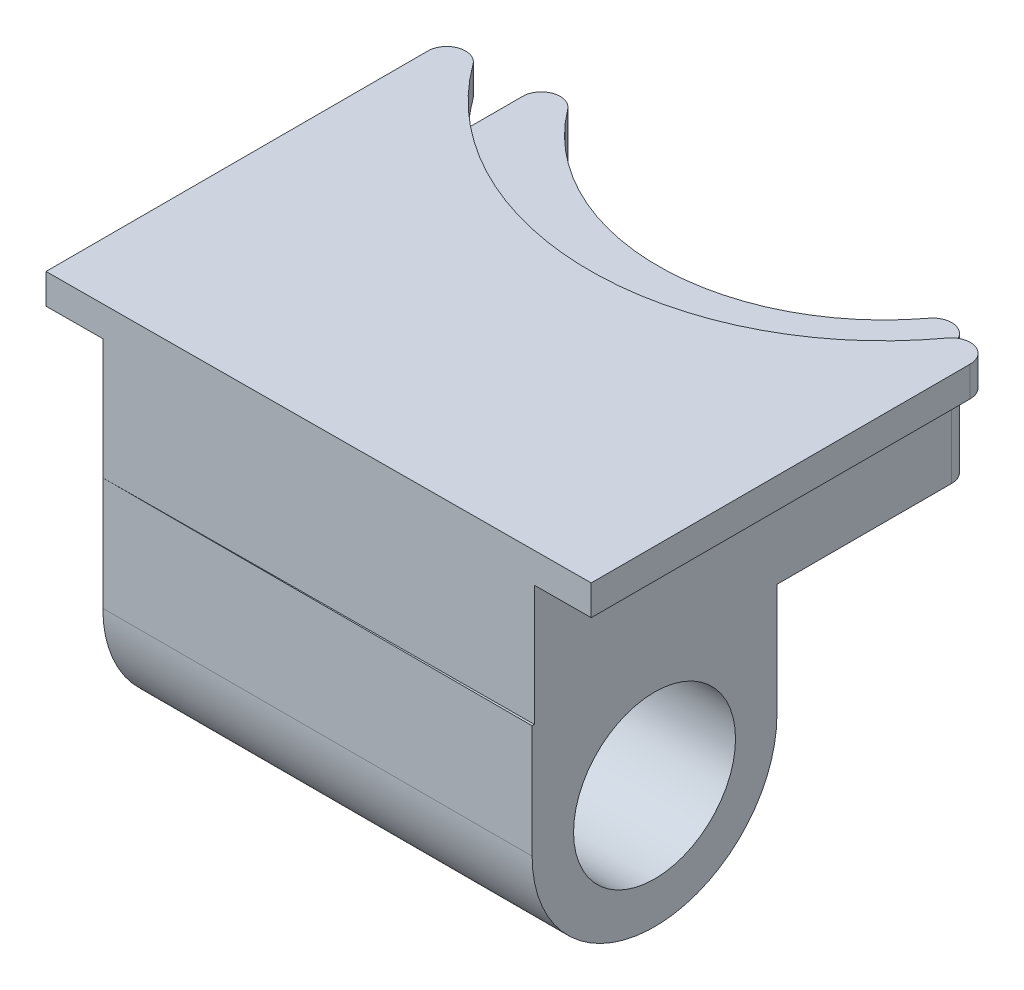
ISO-10303-21;
HEADER;
FILE_DESCRIPTION(('STEP AP214'),'2;1');
FILE_NAME('part.step','',(''),(''),'','','');
FILE_SCHEMA(('AUTOMOTIVE_DESIGN { 1 0 10303 214 1 1 1 1 }'));
ENDSEC;
DATA;
#1=APPLICATION_CONTEXT('core data for automotive mechanical design processes');
#2=APPLICATION_PROTOCOL_DEFINITION('international standard','automotive_design',2000,#1);
#3=PRODUCT_CONTEXT('',#1,'mechanical');
#4=PRODUCT('Part','Part','',(#3));
#5=PRODUCT_RELATED_PRODUCT_CATEGORY('part','',(#4));
#6=PRODUCT_DEFINITION_FORMATION('','',#4);
#7=PRODUCT_DEFINITION_CONTEXT('part definition',#1,'design');
#8=PRODUCT_DEFINITION('design','',#6,#7);
#9=PRODUCT_DEFINITION_SHAPE('','',#8);
#10=(LENGTH_UNIT() NAMED_UNIT(*) SI_UNIT(.MILLI.,.METRE.));
#11=(NAMED_UNIT(*) PLANE_ANGLE_UNIT() SI_UNIT($,.RADIAN.));
#12=(NAMED_UNIT(*) SI_UNIT($,.STERADIAN.) SOLID_ANGLE_UNIT());
#13=UNCERTAINTY_MEASURE_WITH_UNIT(LENGTH_MEASURE(1.E-05),#10,'distance_accuracy_value','');
#14=(GEOMETRIC_REPRESENTATION_CONTEXT(3) GLOBAL_UNCERTAINTY_ASSIGNED_CONTEXT((#13)) GLOBAL_UNIT_ASSIGNED_CONTEXT((#10,
#11,#12)) REPRESENTATION_CONTEXT('',''));
#15=CARTESIAN_POINT('',(0.,0.,0.));
#16=DIRECTION('',(0.,0.,1.));
#17=DIRECTION('',(1.,0.,0.));
#18=AXIS2_PLACEMENT_3D('',#15,#16,#17);
#19=CARTESIAN_POINT('',(0.000957071459153913,4.,-0.0129703369035582));
#20=DIRECTION('',(0.,-1.,0.));
#21=DIRECTION('',(0.,0.,-1.));
#22=AXIS2_PLACEMENT_3D('',#19,#20,#21);
#23=CYLINDRICAL_SURFACE('',#22,6.);
#24=CARTESIAN_POINT('',(0.000957071459153913,3.2,-0.0129703369035582));
#25=DIRECTION('',(0.,1.,0.));
#26=DIRECTION('',(0.,0.,1.));
#27=AXIS2_PLACEMENT_3D('',#24,#25,#26);
#28=CIRCLE('',#27,6.);
#29=CARTESIAN_POINT('',(-4.79902998778424,3.2,3.58704691737398));
#30=VERTEX_POINT('',#29);
#31=CARTESIAN_POINT('',(4.79917722954718,3.2,3.58940156429122));
#32=VERTEX_POINT('',#31);
#33=EDGE_CURVE('E204',#30,#32,#28,.T.);
#34=ORIENTED_EDGE('',*,*,#33,.T.);
#35=DIRECTION('',(0.,-1.,0.));
#36=VECTOR('',#35,1.);
#37=CARTESIAN_POINT('',(4.79917722954718,4.,3.58940156429122));
#38=LINE('',#37,#36);
#39=CARTESIAN_POINT('',(4.79917722954718,0.,3.58940156429122));
#40=VERTEX_POINT('',#39);
#41=EDGE_CURVE('E259',#32,#40,#38,.T.);
#42=ORIENTED_EDGE('',*,*,#41,.T.);
#43=CARTESIAN_POINT('',(0.000957071459153913,0.,-0.0129703369035582));
#44=DIRECTION('',(0.,1.,0.));
#45=DIRECTION('',(0.,0.,1.));
#46=AXIS2_PLACEMENT_3D('',#43,#44,#45);
#47=CIRCLE('',#46,6.);
#48=CARTESIAN_POINT('',(-4.79902998778424,0.,3.58704691737398));
#49=VERTEX_POINT('',#48);
#50=EDGE_CURVE('E242',#49,#40,#47,.T.);
#51=ORIENTED_EDGE('',*,*,#50,.F.);
#52=DIRECTION('',(0.,-1.,0.));
#53=VECTOR('',#52,1.);
#54=CARTESIAN_POINT('',(-4.79902998778424,4.,3.58704691737398));
#55=LINE('',#54,#53);
#56=EDGE_CURVE('E256',#49,#30,#55,.F.);
#57=ORIENTED_EDGE('',*,*,#56,.T.);
#58=EDGE_LOOP('',(#34,#42,#51,#57));
#59=FACE_BOUND('',#58,.T.);
#60=ADVANCED_FACE('F42',(#59),#23,.F.);
#61=CARTESIAN_POINT('',(-5.69902890938785,0.,0.299999999999997));
#62=DIRECTION('',(-1.,0.,0.));
#63=DIRECTION('',(0.,0.,1.));
#64=AXIS2_PLACEMENT_3D('',#61,#62,#63);
#65=PLANE('',#64);
#66=DIRECTION('',(0.,0.,-1.));
#67=VECTOR('',#66,1.);
#68=CARTESIAN_POINT('',(-5.69902890938785,3.2,0.299999999999997));
#69=LINE('',#68,#67);
#70=CARTESIAN_POINT('',(-5.69902890938785,3.2,5.32551119517756));
#71=VERTEX_POINT('',#70);
#72=CARTESIAN_POINT('',(-5.69902890938785,3.2,3.88704835523044));
#73=VERTEX_POINT('',#72);
#74=EDGE_CURVE('E207',#71,#73,#69,.T.);
#75=ORIENTED_EDGE('',*,*,#74,.T.);
#76=DIRECTION('',(0.,-1.,0.));
#77=VECTOR('',#76,1.);
#78=CARTESIAN_POINT('',(-5.69902890938785,0.,3.88704835523044));
#79=LINE('',#78,#77);
#80=CARTESIAN_POINT('',(-5.69902890938785,0.,3.88704835523044));
#81=VERTEX_POINT('',#80);
#82=EDGE_CURVE('E12',#73,#81,#79,.T.);
#83=ORIENTED_EDGE('',*,*,#82,.T.);
#84=DIRECTION('',(0.,0.,1.));
#85=VECTOR('',#84,1.);
#86=CARTESIAN_POINT('',(-5.69902890938785,0.,0.299999999999997));
#87=LINE('',#86,#85);
#88=CARTESIAN_POINT('',(-5.69902890938785,0.,8.53014904998992));
#89=VERTEX_POINT('',#88);
#90=EDGE_CURVE('E248',#81,#89,#87,.T.);
#91=ORIENTED_EDGE('',*,*,#90,.T.);
#92=DIRECTION('',(0.,-1.,0.));
#93=VECTOR('',#92,1.);
#94=CARTESIAN_POINT('',(-5.69902890938785,-3.,8.53014904998992));
#95=LINE('',#94,#93);
#96=CARTESIAN_POINT('',(-5.69902890938785,-3.,8.53014904998992));
#97=VERTEX_POINT('',#96);
#98=EDGE_CURVE('E57',#89,#97,#95,.T.);
#99=ORIENTED_EDGE('',*,*,#98,.T.);
#100=CARTESIAN_POINT('',(-5.69902890938785,-3.,11.7801490499899));
#101=DIRECTION('',(-1.,0.,0.));
#102=DIRECTION('',(0.,0.,-1.));
#103=AXIS2_PLACEMENT_3D('',#100,#101,#102);
#104=CIRCLE('',#103,3.25);
#105=CARTESIAN_POINT('',(-5.69902890938785,-3.,15.0301490499899));
#106=VERTEX_POINT('',#105);
#107=EDGE_CURVE('E345',#97,#106,#104,.T.);
#108=ORIENTED_EDGE('',*,*,#107,.T.);
#109=DIRECTION('',(0.,1.,0.));
#110=VECTOR('',#109,1.);
#111=CARTESIAN_POINT('',(-5.69902890938785,0.,15.0301490499899));
#112=LINE('',#111,#110);
#113=CARTESIAN_POINT('',(-5.69902890938785,0.,15.0301490499899));
#114=VERTEX_POINT('',#113);
#115=EDGE_CURVE('E313',#106,#114,#112,.T.);
#116=ORIENTED_EDGE('',*,*,#115,.T.);
#117=DIRECTION('',(0.,1.,0.));
#118=VECTOR('',#117,1.);
#119=CARTESIAN_POINT('',(-5.69902890938785,4.,15.0301490499899));
#120=LINE('',#119,#118);
#121=CARTESIAN_POINT('',(-5.69902890938785,3.2,15.0301490499899));
#122=VERTEX_POINT('',#121);
#123=EDGE_CURVE('E241',#114,#122,#120,.T.);
#124=ORIENTED_EDGE('',*,*,#123,.T.);
#125=DIRECTION('',(0.,0.,-1.));
#126=VECTOR('',#125,1.);
#127=CARTESIAN_POINT('',(-5.69902890938785,3.2,0.299999999999997));
#128=LINE('',#127,#126);
#129=EDGE_CURVE('E234',#122,#71,#128,.T.);
#130=ORIENTED_EDGE('',*,*,#129,.T.);
#131=EDGE_LOOP('',(#75,#83,#91,#99,#108,#116,#124,#130));
#132=FACE_BOUND('',#131,.T.);
#133=CARTESIAN_POINT('',(-5.69902890938785,-3.,11.7801490499899));
#134=DIRECTION('',(-1.,0.,0.));
#135=DIRECTION('',(0.,0.,1.));
#136=AXIS2_PLACEMENT_3D('',#133,#134,#135);
#137=CIRCLE('',#136,2.14999999999998);
#138=CARTESIAN_POINT('',(-5.69902890938785,-3.,13.9301490499899));
#139=VERTEX_POINT('',#138);
#140=EDGE_CURVE('E180',#139,#139,#137,.T.);
#141=ORIENTED_EDGE('',*,*,#140,.F.);
#142=EDGE_LOOP('',(#141));
#143=FACE_BOUND('',#142,.T.);
#144=ADVANCED_FACE('F309',(#132,#143),#65,.T.);
#145=CARTESIAN_POINT('',(5.69902890938785,0.,19.5695557882271));
#146=DIRECTION('',(1.,0.,0.));
#147=DIRECTION('',(0.,0.,-1.));
#148=AXIS2_PLACEMENT_3D('',#145,#146,#147);
#149=PLANE('',#148);
#150=DIRECTION('',(0.,-1.,0.));
#151=VECTOR('',#150,1.);
#152=CARTESIAN_POINT('',(5.69902890938785,4.,14.9703067405696));
#153=LINE('',#152,#151);
#154=CARTESIAN_POINT('',(5.69902890938785,3.2,14.9703067405696));
#155=VERTEX_POINT('',#154);
#156=CARTESIAN_POINT('',(5.69902890938785,0.,14.9703067405696));
#157=VERTEX_POINT('',#156);
#158=EDGE_CURVE('E167',#155,#157,#153,.T.);
#159=ORIENTED_EDGE('',*,*,#158,.T.);
#160=DIRECTION('',(0.,0.,-1.));
#161=VECTOR('',#160,1.);
#162=CARTESIAN_POINT('',(5.69902890938785,0.,15.0301490499899));
#163=LINE('',#162,#161);
#164=CARTESIAN_POINT('',(5.69902890938785,0.,15.0301490499899));
#165=VERTEX_POINT('',#164);
#166=EDGE_CURVE('E158',#165,#157,#163,.T.);
#167=ORIENTED_EDGE('',*,*,#166,.F.);
#168=DIRECTION('',(0.,1.,0.));
#169=VECTOR('',#168,1.);
#170=CARTESIAN_POINT('',(5.69902890938785,0.,15.0301490499899));
#171=LINE('',#170,#169);
#172=CARTESIAN_POINT('',(5.69902890938785,-3.,15.0301490499899));
#173=VERTEX_POINT('',#172);
#174=EDGE_CURVE('E163',#173,#165,#171,.T.);
#175=ORIENTED_EDGE('',*,*,#174,.F.);
#176=CARTESIAN_POINT('',(5.69902890938785,-3.,11.7801490499899));
#177=DIRECTION('',(1.,0.,0.));
#178=DIRECTION('',(0.,0.,-1.));
#179=AXIS2_PLACEMENT_3D('',#176,#177,#178);
#180=CIRCLE('',#179,3.25);
#181=CARTESIAN_POINT('',(5.69902890938785,-3.,8.53014904998992));
#182=VERTEX_POINT('',#181);
#183=EDGE_CURVE('E191',#182,#173,#180,.F.);
#184=ORIENTED_EDGE('',*,*,#183,.F.);
#185=DIRECTION('',(0.,-1.,0.));
#186=VECTOR('',#185,1.);
#187=CARTESIAN_POINT('',(5.69902890938785,-3.,8.53014904998992));
#188=LINE('',#187,#186);
#189=CARTESIAN_POINT('',(5.69902890938785,0.,8.53014904998992));
#190=VERTEX_POINT('',#189);
#191=EDGE_CURVE('E193',#190,#182,#188,.T.);
#192=ORIENTED_EDGE('',*,*,#191,.F.);
#193=DIRECTION('',(0.,0.,-1.));
#194=VECTOR('',#193,1.);
#195=CARTESIAN_POINT('',(5.69902890938785,0.,19.5695557882271));
#196=LINE('',#195,#194);
#197=CARTESIAN_POINT('',(5.69902890938785,0.,3.88959922272413));
#198=VERTEX_POINT('',#197);
#199=EDGE_CURVE('E247',#190,#198,#196,.T.);
#200=ORIENTED_EDGE('',*,*,#199,.T.);
#201=DIRECTION('',(0.,-1.,0.));
#202=VECTOR('',#201,1.);
#203=CARTESIAN_POINT('',(5.69902890938785,0.,3.88959922272412));
#204=LINE('',#203,#202);
#205=CARTESIAN_POINT('',(5.69902890938785,3.2,3.88959922272412));
#206=VERTEX_POINT('',#205);
#207=EDGE_CURVE('E267',#198,#206,#204,.F.);
#208=ORIENTED_EDGE('',*,*,#207,.T.);
#209=DIRECTION('',(0.,0.,1.));
#210=VECTOR('',#209,1.);
#211=CARTESIAN_POINT('',(5.69902890938785,3.2,19.5695557882271));
#212=LINE('',#211,#210);
#213=CARTESIAN_POINT('',(5.69902890938785,3.2,5.32551119517756));
#214=VERTEX_POINT('',#213);
#215=EDGE_CURVE('E201',#206,#214,#212,.T.);
#216=ORIENTED_EDGE('',*,*,#215,.T.);
#217=DIRECTION('',(0.,0.,1.));
#218=VECTOR('',#217,1.);
#219=CARTESIAN_POINT('',(5.69902890938785,3.2,19.5695557882271));
#220=LINE('',#219,#218);
#221=EDGE_CURVE('E252',#214,#155,#220,.T.);
#222=ORIENTED_EDGE('',*,*,#221,.T.);
#223=EDGE_LOOP('',(#159,#167,#175,#184,#192,#200,#208,#216,#222));
#224=FACE_BOUND('',#223,.T.);
#225=CARTESIAN_POINT('',(5.69902890938785,-3.,11.7801490499899));
#226=DIRECTION('',(1.,0.,0.));
#227=DIRECTION('',(0.,0.,-1.));
#228=AXIS2_PLACEMENT_3D('',#225,#226,#227);
#229=CIRCLE('',#228,2.14999999999998);
#230=CARTESIAN_POINT('',(5.69902890938785,-3.,9.63014904998995));
#231=VERTEX_POINT('',#230);
#232=EDGE_CURVE('E189',#231,#231,#229,.F.);
#233=ORIENTED_EDGE('',*,*,#232,.T.);
#234=EDGE_LOOP('',(#233));
#235=FACE_BOUND('',#234,.T.);
#236=ADVANCED_FACE('F160',(#224,#235),#149,.T.);
#237=CARTESIAN_POINT('',(0.0390904513321626,4.,-0.0265240419706443));
#238=DIRECTION('',(0.,1.,0.));
#239=DIRECTION('',(0.,0.,1.));
#240=AXIS2_PLACEMENT_3D('',#237,#238,#239);
#241=PLANE('',#240);
#242=DIRECTION('',(0.,0.,-1.));
#243=VECTOR('',#242,1.);
#244=CARTESIAN_POINT('',(7.2,4.,14.6624221776615));
#245=LINE('',#244,#243);
#246=CARTESIAN_POINT('',(7.2,4.,14.9624263123542));
#247=VERTEX_POINT('',#246);
#248=CARTESIAN_POINT('',(7.2,4.,4.89897948556635));
#249=VERTEX_POINT('',#248);
#250=EDGE_CURVE('E228',#247,#249,#245,.T.);
#251=ORIENTED_EDGE('',*,*,#250,.T.);
#252=CARTESIAN_POINT('',(6.7,4.,4.89897948556635));
#253=DIRECTION('',(0.,1.,0.));
#254=DIRECTION('',(0.,0.,1.));
#255=AXIS2_PLACEMENT_3D('',#252,#253,#254);
#256=CIRCLE('',#255,0.5);
#257=CARTESIAN_POINT('',(6.29638554216868,4.,4.6038602394479));
#258=VERTEX_POINT('',#257);
#259=EDGE_CURVE('E278',#249,#258,#256,.T.);
#260=ORIENTED_EDGE('',*,*,#259,.T.);
#261=CARTESIAN_POINT('',(0.,4.,0.));
#262=DIRECTION('',(0.,-1.,0.));
#263=DIRECTION('',(0.,0.,1.));
#264=AXIS2_PLACEMENT_3D('',#261,#262,#263);
#265=CIRCLE('',#264,7.8);
#266=CARTESIAN_POINT('',(-6.29638554216868,4.,4.6038602394479));
#267=VERTEX_POINT('',#266);
#268=EDGE_CURVE('E210',#258,#267,#265,.T.);
#269=ORIENTED_EDGE('',*,*,#268,.T.);
#270=CARTESIAN_POINT('',(-6.7,4.,4.89897948556636));
#271=DIRECTION('',(0.,1.,0.));
#272=DIRECTION('',(0.,0.,1.));
#273=AXIS2_PLACEMENT_3D('',#270,#271,#272);
#274=CIRCLE('',#273,0.5);
#275=CARTESIAN_POINT('',(-7.2,4.,4.89897948556636));
#276=VERTEX_POINT('',#275);
#277=EDGE_CURVE('E276',#267,#276,#274,.T.);
#278=ORIENTED_EDGE('',*,*,#277,.T.);
#279=DIRECTION('',(0.,0.,1.));
#280=VECTOR('',#279,1.);
#281=CARTESIAN_POINT('',(-7.2,4.,14.7380253435125));
#282=LINE('',#281,#280);
#283=CARTESIAN_POINT('',(-7.2,4.,15.0380294782053));
#284=VERTEX_POINT('',#283);
#285=EDGE_CURVE('E226',#276,#284,#282,.T.);
#286=ORIENTED_EDGE('',*,*,#285,.T.);
#287=DIRECTION('',(0.999986217880685,0.,-0.00525014749161145));
#288=VECTOR('',#287,1.);
#289=CARTESIAN_POINT('',(0.0390904513321626,4.,15.0000226618162));
#290=LINE('',#289,#288);
#291=EDGE_CURVE('E239',#284,#247,#290,.T.);
#292=ORIENTED_EDGE('',*,*,#291,.T.);
#293=EDGE_LOOP('',(#251,#260,#269,#278,#286,#292));
#294=FACE_BOUND('',#293,.T.);
#295=ADVANCED_FACE('F301',(#294),#241,.T.);
#296=CARTESIAN_POINT('',(0.0390904513321626,0.,-0.0265240419706443));
#297=DIRECTION('',(0.,1.,0.));
#298=DIRECTION('',(0.,0.,1.));
#299=AXIS2_PLACEMENT_3D('',#296,#297,#298);
#300=PLANE('',#299);
#301=ORIENTED_EDGE('',*,*,#199,.F.);
#302=DIRECTION('',(-1.,0.,0.));
#303=VECTOR('',#302,1.);
#304=CARTESIAN_POINT('',(14.7163733078236,0.,8.53014904998992));
#305=LINE('',#304,#303);
#306=EDGE_CURVE('E170',#190,#89,#305,.T.);
#307=ORIENTED_EDGE('',*,*,#306,.T.);
#308=ORIENTED_EDGE('',*,*,#90,.F.);
#309=CARTESIAN_POINT('',(-5.19902890938785,0.,3.88704835523044));
#310=DIRECTION('',(0.,1.,0.));
#311=DIRECTION('',(0.,0.,1.));
#312=AXIS2_PLACEMENT_3D('',#309,#310,#311);
#313=CIRCLE('',#312,0.5);
#314=EDGE_CURVE('E262',#81,#49,#313,.F.);
#315=ORIENTED_EDGE('',*,*,#314,.T.);
#316=ORIENTED_EDGE('',*,*,#50,.T.);
#317=CARTESIAN_POINT('',(5.19902890938785,0.,3.88959922272412));
#318=DIRECTION('',(0.,1.,0.));
#319=DIRECTION('',(0.,0.,1.));
#320=AXIS2_PLACEMENT_3D('',#317,#318,#319);
#321=CIRCLE('',#320,0.5);
#322=EDGE_CURVE('E264',#40,#198,#321,.F.);
#323=ORIENTED_EDGE('',*,*,#322,.T.);
#324=EDGE_LOOP('',(#301,#307,#308,#315,#316,#323));
#325=FACE_BOUND('',#324,.T.);
#326=ADVANCED_FACE('F342',(#325),#300,.F.);
#327=CARTESIAN_POINT('',(0.0390904513321626,4.,15.0000226618162));
#328=DIRECTION('',(-0.00525014749161145,0.,-0.999986217880685));
#329=DIRECTION('',(-0.999986217880685,0.,0.00525014749161145));
#330=AXIS2_PLACEMENT_3D('',#327,#328,#329);
#331=PLANE('',#330);
#332=ORIENTED_EDGE('',*,*,#291,.F.);
#333=DIRECTION('',(0.,1.,0.));
#334=VECTOR('',#333,1.);
#335=CARTESIAN_POINT('',(-7.2,3.2,15.0380294782053));
#336=LINE('',#335,#334);
#337=CARTESIAN_POINT('',(-7.2,3.2,15.0380294782053));
#338=VERTEX_POINT('',#337);
#339=EDGE_CURVE('E223',#338,#284,#336,.T.);
#340=ORIENTED_EDGE('',*,*,#339,.F.);
#341=DIRECTION('',(0.999986217880685,0.,-0.00525014749161146));
#342=VECTOR('',#341,1.);
#343=CARTESIAN_POINT('',(-7.2,3.2,15.0380294782053));
#344=LINE('',#343,#342);
#345=EDGE_CURVE('E217',#338,#122,#344,.T.);
#346=ORIENTED_EDGE('',*,*,#345,.T.);
#347=ORIENTED_EDGE('',*,*,#123,.F.);
#348=DIRECTION('',(0.999986217880685,0.,-0.00525014749161145));
#349=VECTOR('',#348,1.);
#350=CARTESIAN_POINT('',(0.0390904513321626,0.,15.0000226618162));
#351=LINE('',#350,#349);
#352=EDGE_CURVE('E176',#114,#157,#351,.T.);
#353=ORIENTED_EDGE('',*,*,#352,.T.);
#354=ORIENTED_EDGE('',*,*,#158,.F.);
#355=CARTESIAN_POINT('',(7.2,3.2,14.9624263123542));
#356=VERTEX_POINT('',#355);
#357=EDGE_CURVE('E216',#155,#356,#344,.T.);
#358=ORIENTED_EDGE('',*,*,#357,.T.);
#359=DIRECTION('',(0.,1.,0.));
#360=VECTOR('',#359,1.);
#361=CARTESIAN_POINT('',(7.2,3.2,14.9624263123542));
#362=LINE('',#361,#360);
#363=EDGE_CURVE('E231',#356,#247,#362,.T.);
#364=ORIENTED_EDGE('',*,*,#363,.T.);
#365=EDGE_LOOP('',(#332,#340,#346,#347,#353,#354,#358,#364));
#366=FACE_BOUND('',#365,.T.);
#367=ADVANCED_FACE('F306',(#366),#331,.F.);
#368=CARTESIAN_POINT('',(7.2,3.2,14.6624221776615));
#369=DIRECTION('',(1.,0.,0.));
#370=DIRECTION('',(0.,0.,-1.));
#371=AXIS2_PLACEMENT_3D('',#368,#369,#370);
#372=PLANE('',#371);
#373=DIRECTION('',(0.,0.,-1.));
#374=VECTOR('',#373,1.);
#375=CARTESIAN_POINT('',(7.2,3.2,14.9624263123542));
#376=LINE('',#375,#374);
#377=CARTESIAN_POINT('',(7.2,3.2,4.89897948556636));
#378=VERTEX_POINT('',#377);
#379=EDGE_CURVE('E220',#356,#378,#376,.T.);
#380=ORIENTED_EDGE('',*,*,#379,.T.);
#381=DIRECTION('',(0.,1.,0.));
#382=VECTOR('',#381,1.);
#383=CARTESIAN_POINT('',(7.2,3.2,4.89897948556635));
#384=LINE('',#383,#382);
#385=EDGE_CURVE('E273',#378,#249,#384,.T.);
#386=ORIENTED_EDGE('',*,*,#385,.T.);
#387=ORIENTED_EDGE('',*,*,#250,.F.);
#388=ORIENTED_EDGE('',*,*,#363,.F.);
#389=EDGE_LOOP('',(#380,#386,#387,#388));
#390=FACE_BOUND('',#389,.T.);
#391=ADVANCED_FACE('F320',(#390),#372,.T.);
#392=CARTESIAN_POINT('',(0.,3.2,0.));
#393=DIRECTION('',(0.,1.,0.));
#394=DIRECTION('',(0.,0.,1.));
#395=AXIS2_PLACEMENT_3D('',#392,#393,#394);
#396=PLANE('',#395);
#397=CARTESIAN_POINT('',(0.,3.2,0.));
#398=DIRECTION('',(0.,-1.,0.));
#399=DIRECTION('',(0.,0.,1.));
#400=AXIS2_PLACEMENT_3D('',#397,#398,#399);
#401=CIRCLE('',#400,7.8);
#402=CARTESIAN_POINT('',(6.29638554216868,3.2,4.6038602394479));
#403=VERTEX_POINT('',#402);
#404=EDGE_CURVE('E211',#403,#214,#401,.T.);
#405=ORIENTED_EDGE('',*,*,#404,.F.);
#406=CARTESIAN_POINT('',(6.7,3.2,4.89897948556635));
#407=DIRECTION('',(0.,1.,0.));
#408=DIRECTION('',(0.,0.,1.));
#409=AXIS2_PLACEMENT_3D('',#406,#407,#408);
#410=CIRCLE('',#409,0.5);
#411=EDGE_CURVE('E285',#403,#378,#410,.F.);
#412=ORIENTED_EDGE('',*,*,#411,.T.);
#413=ORIENTED_EDGE('',*,*,#379,.F.);
#414=ORIENTED_EDGE('',*,*,#357,.F.);
#415=ORIENTED_EDGE('',*,*,#221,.F.);
#416=EDGE_LOOP('',(#405,#412,#413,#414,#415));
#417=FACE_BOUND('',#416,.T.);
#418=ADVANCED_FACE('F323',(#417),#396,.F.);
#419=CARTESIAN_POINT('',(0.,3.2,0.));
#420=DIRECTION('',(0.,1.,0.));
#421=DIRECTION('',(0.,0.,1.));
#422=AXIS2_PLACEMENT_3D('',#419,#420,#421);
#423=CYLINDRICAL_SURFACE('',#422,7.8);
#424=ORIENTED_EDGE('',*,*,#268,.F.);
#425=DIRECTION('',(0.,1.,0.));
#426=VECTOR('',#425,1.);
#427=CARTESIAN_POINT('',(6.29638554216868,3.2,4.6038602394479));
#428=LINE('',#427,#426);
#429=EDGE_CURVE('E283',#258,#403,#428,.F.);
#430=ORIENTED_EDGE('',*,*,#429,.T.);
#431=ORIENTED_EDGE('',*,*,#404,.T.);
#432=CARTESIAN_POINT('',(0.,3.2,0.));
#433=DIRECTION('',(0.,1.,0.));
#434=DIRECTION('',(0.,0.,1.));
#435=AXIS2_PLACEMENT_3D('',#432,#433,#434);
#436=CIRCLE('',#435,7.8);
#437=EDGE_CURVE('E198',#214,#71,#436,.F.);
#438=ORIENTED_EDGE('',*,*,#437,.T.);
#439=CARTESIAN_POINT('',(-6.29638554216868,3.2,4.6038602394479));
#440=VERTEX_POINT('',#439);
#441=EDGE_CURVE('E214',#71,#440,#401,.T.);
#442=ORIENTED_EDGE('',*,*,#441,.T.);
#443=DIRECTION('',(0.,1.,0.));
#444=VECTOR('',#443,1.);
#445=CARTESIAN_POINT('',(-6.29638554216868,3.2,4.6038602394479));
#446=LINE('',#445,#444);
#447=EDGE_CURVE('E280',#440,#267,#446,.T.);
#448=ORIENTED_EDGE('',*,*,#447,.T.);
#449=EDGE_LOOP('',(#424,#430,#431,#438,#442,#448));
#450=FACE_BOUND('',#449,.T.);
#451=ADVANCED_FACE('F297',(#450),#423,.F.);
#452=DIRECTION('',(0.,0.,1.));
#453=VECTOR('',#452,1.);
#454=CARTESIAN_POINT('',(-7.2,3.2,3.));
#455=LINE('',#454,#453);
#456=CARTESIAN_POINT('',(-7.2,3.2,4.89897948556636));
#457=VERTEX_POINT('',#456);
#458=EDGE_CURVE('E213',#457,#338,#455,.T.);
#459=ORIENTED_EDGE('',*,*,#458,.F.);
#460=CARTESIAN_POINT('',(-6.7,3.2,4.89897948556636));
#461=DIRECTION('',(0.,1.,0.));
#462=DIRECTION('',(0.,0.,1.));
#463=AXIS2_PLACEMENT_3D('',#460,#461,#462);
#464=CIRCLE('',#463,0.5);
#465=EDGE_CURVE('E50',#457,#440,#464,.F.);
#466=ORIENTED_EDGE('',*,*,#465,.T.);
#467=ORIENTED_EDGE('',*,*,#441,.F.);
#468=ORIENTED_EDGE('',*,*,#129,.F.);
#469=ORIENTED_EDGE('',*,*,#345,.F.);
#470=EDGE_LOOP('',(#459,#466,#467,#468,#469));
#471=FACE_BOUND('',#470,.T.);
#472=ADVANCED_FACE('F291',(#471),#396,.F.);
#473=CARTESIAN_POINT('',(-7.2,3.2,14.7380253435125));
#474=DIRECTION('',(-1.,0.,0.));
#475=DIRECTION('',(0.,0.,1.));
#476=AXIS2_PLACEMENT_3D('',#473,#474,#475);
#477=PLANE('',#476);
#478=ORIENTED_EDGE('',*,*,#285,.F.);
#479=DIRECTION('',(0.,1.,0.));
#480=VECTOR('',#479,1.);
#481=CARTESIAN_POINT('',(-7.2,3.2,4.89897948556636));
#482=LINE('',#481,#480);
#483=EDGE_CURVE('E65',#276,#457,#482,.F.);
#484=ORIENTED_EDGE('',*,*,#483,.T.);
#485=ORIENTED_EDGE('',*,*,#458,.T.);
#486=ORIENTED_EDGE('',*,*,#339,.T.);
#487=EDGE_LOOP('',(#478,#484,#485,#486));
#488=FACE_BOUND('',#487,.T.);
#489=ADVANCED_FACE('F303',(#488),#477,.T.);
#490=CARTESIAN_POINT('',(0.,3.2,0.));
#491=DIRECTION('',(0.,1.,0.));
#492=DIRECTION('',(0.,0.,1.));
#493=AXIS2_PLACEMENT_3D('',#490,#491,#492);
#494=PLANE('',#493);
#495=ORIENTED_EDGE('',*,*,#215,.F.);
#496=CARTESIAN_POINT('',(5.19902890938785,3.2,3.88959922272412));
#497=DIRECTION('',(0.,1.,0.));
#498=DIRECTION('',(0.,0.,1.));
#499=AXIS2_PLACEMENT_3D('',#496,#497,#498);
#500=CIRCLE('',#499,0.5);
#501=EDGE_CURVE('E271',#206,#32,#500,.T.);
#502=ORIENTED_EDGE('',*,*,#501,.T.);
#503=ORIENTED_EDGE('',*,*,#33,.F.);
#504=CARTESIAN_POINT('',(-5.19902890938785,3.2,3.88704835523044));
#505=DIRECTION('',(0.,1.,0.));
#506=DIRECTION('',(0.,0.,1.));
#507=AXIS2_PLACEMENT_3D('',#504,#505,#506);
#508=CIRCLE('',#507,0.5);
#509=EDGE_CURVE('E269',#30,#73,#508,.T.);
#510=ORIENTED_EDGE('',*,*,#509,.T.);
#511=ORIENTED_EDGE('',*,*,#74,.F.);
#512=ORIENTED_EDGE('',*,*,#437,.F.);
#513=EDGE_LOOP('',(#495,#502,#503,#510,#511,#512));
#514=FACE_BOUND('',#513,.T.);
#515=ADVANCED_FACE('F332',(#514),#494,.T.);
#516=CARTESIAN_POINT('',(5.19902890938785,4.,3.88959922272412));
#517=DIRECTION('',(0.,-1.,0.));
#518=DIRECTION('',(0.,0.,-1.));
#519=AXIS2_PLACEMENT_3D('',#516,#517,#518);
#520=CYLINDRICAL_SURFACE('',#519,0.5);
#521=ORIENTED_EDGE('',*,*,#501,.F.);
#522=ORIENTED_EDGE('',*,*,#207,.F.);
#523=ORIENTED_EDGE('',*,*,#322,.F.);
#524=ORIENTED_EDGE('',*,*,#41,.F.);
#525=EDGE_LOOP('',(#521,#522,#523,#524));
#526=FACE_BOUND('',#525,.T.);
#527=ADVANCED_FACE('F366',(#526),#520,.T.);
#528=CARTESIAN_POINT('',(6.7,3.2,4.89897948556635));
#529=DIRECTION('',(0.,1.,0.));
#530=DIRECTION('',(0.,0.,1.));
#531=AXIS2_PLACEMENT_3D('',#528,#529,#530);
#532=CYLINDRICAL_SURFACE('',#531,0.5);
#533=ORIENTED_EDGE('',*,*,#411,.F.);
#534=ORIENTED_EDGE('',*,*,#429,.F.);
#535=ORIENTED_EDGE('',*,*,#259,.F.);
#536=ORIENTED_EDGE('',*,*,#385,.F.);
#537=EDGE_LOOP('',(#533,#534,#535,#536));
#538=FACE_BOUND('',#537,.T.);
#539=ADVANCED_FACE('F327',(#538),#532,.T.);
#540=CARTESIAN_POINT('',(-6.7,3.2,4.89897948556636));
#541=DIRECTION('',(0.,1.,0.));
#542=DIRECTION('',(0.,0.,1.));
#543=AXIS2_PLACEMENT_3D('',#540,#541,#542);
#544=CYLINDRICAL_SURFACE('',#543,0.5);
#545=ORIENTED_EDGE('',*,*,#465,.F.);
#546=ORIENTED_EDGE('',*,*,#483,.F.);
#547=ORIENTED_EDGE('',*,*,#277,.F.);
#548=ORIENTED_EDGE('',*,*,#447,.F.);
#549=EDGE_LOOP('',(#545,#546,#547,#548));
#550=FACE_BOUND('',#549,.T.);
#551=ADVANCED_FACE('F299',(#550),#544,.T.);
#552=CARTESIAN_POINT('',(-5.19902890938785,4.,3.88704835523044));
#553=DIRECTION('',(0.,-1.,0.));
#554=DIRECTION('',(0.,0.,-1.));
#555=AXIS2_PLACEMENT_3D('',#552,#553,#554);
#556=CYLINDRICAL_SURFACE('',#555,0.5);
#557=ORIENTED_EDGE('',*,*,#314,.F.);
#558=ORIENTED_EDGE('',*,*,#82,.F.);
#559=ORIENTED_EDGE('',*,*,#509,.F.);
#560=ORIENTED_EDGE('',*,*,#56,.F.);
#561=EDGE_LOOP('',(#557,#558,#559,#560));
#562=FACE_BOUND('',#561,.T.);
#563=ADVANCED_FACE('F44',(#562),#556,.T.);
#564=CARTESIAN_POINT('',(14.7163733078236,0.,15.0301490499899));
#565=DIRECTION('',(0.,1.,0.));
#566=DIRECTION('',(0.,0.,1.));
#567=AXIS2_PLACEMENT_3D('',#564,#565,#566);
#568=PLANE('',#567);
#569=ORIENTED_EDGE('',*,*,#352,.F.);
#570=DIRECTION('',(-1.,0.,0.));
#571=VECTOR('',#570,1.);
#572=CARTESIAN_POINT('',(14.7163733078236,0.,15.0301490499899));
#573=LINE('',#572,#571);
#574=EDGE_CURVE('E174',#165,#114,#573,.T.);
#575=ORIENTED_EDGE('',*,*,#574,.F.);
#576=ORIENTED_EDGE('',*,*,#166,.T.);
#577=EDGE_LOOP('',(#569,#575,#576));
#578=FACE_BOUND('',#577,.T.);
#579=ADVANCED_FACE('F175',(#578),#568,.T.);
#580=CARTESIAN_POINT('',(14.7163733078236,-3.,11.7801490499899));
#581=DIRECTION('',(-1.,0.,0.));
#582=DIRECTION('',(0.,0.,1.));
#583=AXIS2_PLACEMENT_3D('',#580,#581,#582);
#584=CYLINDRICAL_SURFACE('',#583,3.25);
#585=DIRECTION('',(-1.,0.,0.));
#586=VECTOR('',#585,1.);
#587=CARTESIAN_POINT('',(14.7163733078236,-3.,8.53014904998992));
#588=LINE('',#587,#586);
#589=EDGE_CURVE('E171',#182,#97,#588,.T.);
#590=ORIENTED_EDGE('',*,*,#589,.F.);
#591=ORIENTED_EDGE('',*,*,#183,.T.);
#592=DIRECTION('',(-1.,0.,0.));
#593=VECTOR('',#592,1.);
#594=CARTESIAN_POINT('',(14.7163733078236,-3.,15.0301490499899));
#595=LINE('',#594,#593);
#596=EDGE_CURVE('E184',#173,#106,#595,.T.);
#597=ORIENTED_EDGE('',*,*,#596,.T.);
#598=ORIENTED_EDGE('',*,*,#107,.F.);
#599=EDGE_LOOP('',(#590,#591,#597,#598));
#600=FACE_BOUND('',#599,.T.);
#601=ADVANCED_FACE('F377',(#600),#584,.T.);
#602=CARTESIAN_POINT('',(14.7163733078236,-3.,8.53014904998992));
#603=DIRECTION('',(0.,0.,-1.));
#604=DIRECTION('',(-1.,0.,0.));
#605=AXIS2_PLACEMENT_3D('',#602,#603,#604);
#606=PLANE('',#605);
#607=ORIENTED_EDGE('',*,*,#306,.F.);
#608=ORIENTED_EDGE('',*,*,#191,.T.);
#609=ORIENTED_EDGE('',*,*,#589,.T.);
#610=ORIENTED_EDGE('',*,*,#98,.F.);
#611=EDGE_LOOP('',(#607,#608,#609,#610));
#612=FACE_BOUND('',#611,.T.);
#613=ADVANCED_FACE('F383',(#612),#606,.T.);
#614=CARTESIAN_POINT('',(14.7163733078236,0.,15.0301490499899));
#615=DIRECTION('',(0.,0.,1.));
#616=DIRECTION('',(0.,-1.,0.));
#617=AXIS2_PLACEMENT_3D('',#614,#615,#616);
#618=PLANE('',#617);
#619=ORIENTED_EDGE('',*,*,#596,.F.);
#620=ORIENTED_EDGE('',*,*,#174,.T.);
#621=ORIENTED_EDGE('',*,*,#574,.T.);
#622=ORIENTED_EDGE('',*,*,#115,.F.);
#623=EDGE_LOOP('',(#619,#620,#621,#622));
#624=FACE_BOUND('',#623,.T.);
#625=ADVANCED_FACE('F183',(#624),#618,.T.);
#626=CARTESIAN_POINT('',(14.7163733078236,-3.,11.7801490499899));
#627=DIRECTION('',(-1.,0.,0.));
#628=DIRECTION('',(0.,0.,1.));
#629=AXIS2_PLACEMENT_3D('',#626,#627,#628);
#630=CYLINDRICAL_SURFACE('',#629,2.14999999999998);
#631=ORIENTED_EDGE('',*,*,#140,.T.);
#632=EDGE_LOOP('',(#631));
#633=FACE_BOUND('',#632,.T.);
#634=ORIENTED_EDGE('',*,*,#232,.F.);
#635=EDGE_LOOP('',(#634));
#636=FACE_BOUND('',#635,.T.);
#637=ADVANCED_FACE('F353',(#633,#636),#630,.F.);
#638=CLOSED_SHELL('',(#60,#144,#236,#295,#326,#367,#391,#418,#451,#472,#489,#515,#527,#539,#551,
#563,#579,#601,#613,#625,#637));
#639=MANIFOLD_SOLID_BREP('B2',#638);
#640=ADVANCED_BREP_SHAPE_REPRESENTATION('',(#18,#639),#14);
#641=SHAPE_DEFINITION_REPRESENTATION(#9,#640);
ENDSEC;
END-ISO-10303-21;
